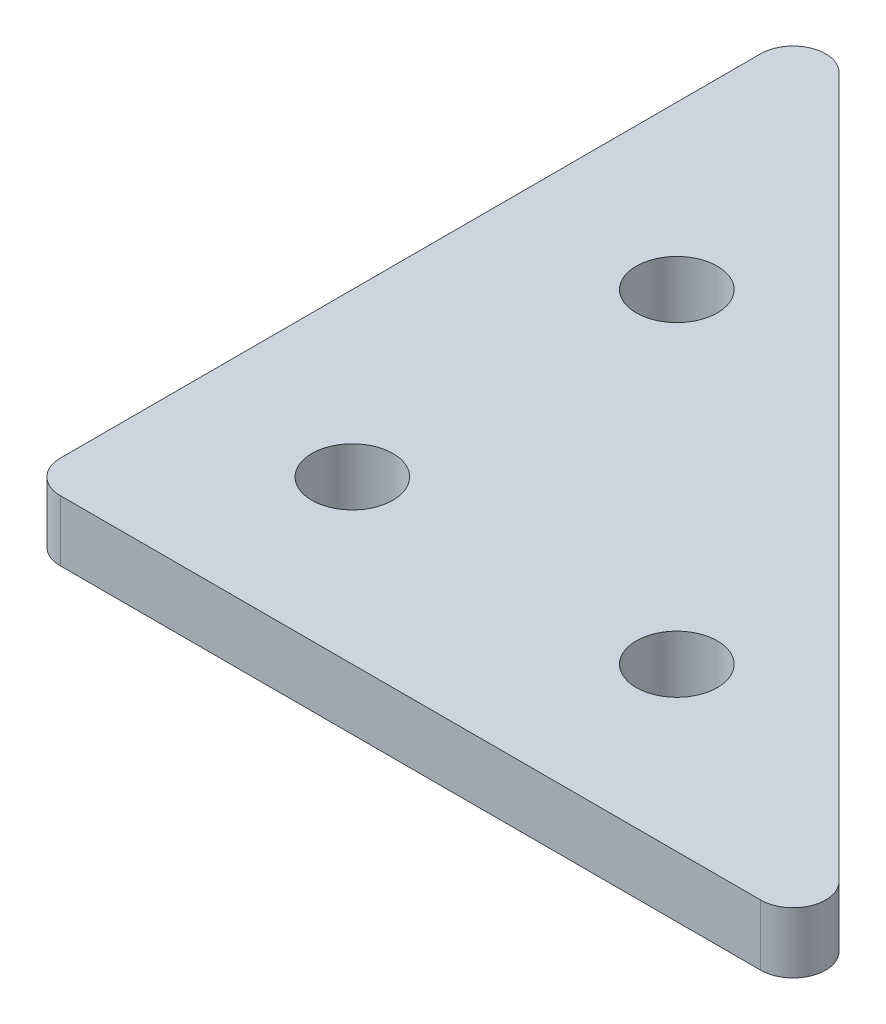
ISO-10303-21;
HEADER;
FILE_DESCRIPTION(('STEP AP214'),'2;1');
FILE_NAME('part.step','',(''),(''),'','','');
FILE_SCHEMA(('AUTOMOTIVE_DESIGN { 1 0 10303 214 1 1 1 1 }'));
ENDSEC;
DATA;
#1=APPLICATION_CONTEXT('core data for automotive mechanical design processes');
#2=APPLICATION_PROTOCOL_DEFINITION('international standard','automotive_design',2000,#1);
#3=PRODUCT_CONTEXT('',#1,'mechanical');
#4=PRODUCT('Part','Part','',(#3));
#5=PRODUCT_RELATED_PRODUCT_CATEGORY('part','',(#4));
#6=PRODUCT_DEFINITION_FORMATION('','',#4);
#7=PRODUCT_DEFINITION_CONTEXT('part definition',#1,'design');
#8=PRODUCT_DEFINITION('design','',#6,#7);
#9=PRODUCT_DEFINITION_SHAPE('','',#8);
#10=(LENGTH_UNIT() NAMED_UNIT(*) SI_UNIT(.MILLI.,.METRE.));
#11=(NAMED_UNIT(*) PLANE_ANGLE_UNIT() SI_UNIT($,.RADIAN.));
#12=(NAMED_UNIT(*) SI_UNIT($,.STERADIAN.) SOLID_ANGLE_UNIT());
#13=UNCERTAINTY_MEASURE_WITH_UNIT(LENGTH_MEASURE(1.E-05),#10,'distance_accuracy_value','');
#14=(GEOMETRIC_REPRESENTATION_CONTEXT(3) GLOBAL_UNCERTAINTY_ASSIGNED_CONTEXT((#13)) GLOBAL_UNIT_ASSIGNED_CONTEXT((#10,
#11,#12)) REPRESENTATION_CONTEXT('',''));
#15=CARTESIAN_POINT('',(0.,0.,0.));
#16=DIRECTION('',(0.,0.,1.));
#17=DIRECTION('',(1.,0.,0.));
#18=AXIS2_PLACEMENT_3D('',#15,#16,#17);
#19=CARTESIAN_POINT('',(-431.938028743079,4.7625,385.332748685498));
#20=DIRECTION('',(0.,-1.,0.));
#21=DIRECTION('',(0.,0.,-1.));
#22=AXIS2_PLACEMENT_3D('',#19,#20,#21);
#23=CYLINDRICAL_SURFACE('',#22,2.54000000000121);
#24=CARTESIAN_POINT('',(-431.938028743079,0.,385.332748685498));
#25=DIRECTION('',(0.,1.,0.));
#26=DIRECTION('',(0.,0.,-1.));
#27=AXIS2_PLACEMENT_3D('',#24,#25,#26);
#28=CIRCLE('',#27,2.54000000000121);
#29=CARTESIAN_POINT('',(-430.141977518862,0.,383.536697461284));
#30=VERTEX_POINT('',#29);
#31=CARTESIAN_POINT('',(-434.478028743079,0.,385.332748685498));
#32=VERTEX_POINT('',#31);
#33=EDGE_CURVE('E121',#30,#32,#28,.T.);
#34=ORIENTED_EDGE('',*,*,#33,.T.);
#35=DIRECTION('',(0.,-1.,0.));
#36=VECTOR('',#35,1.);
#37=CARTESIAN_POINT('',(-434.478028743079,4.7625,385.332748685498));
#38=LINE('',#37,#36);
#39=CARTESIAN_POINT('',(-434.478028743079,4.7625,385.332748685498));
#40=VERTEX_POINT('',#39);
#41=EDGE_CURVE('E11',#40,#32,#38,.T.);
#42=ORIENTED_EDGE('',*,*,#41,.F.);
#43=CARTESIAN_POINT('',(-431.938028743079,4.7625,385.332748685498));
#44=DIRECTION('',(0.,1.,0.));
#45=DIRECTION('',(0.,0.,-1.));
#46=AXIS2_PLACEMENT_3D('',#43,#44,#45);
#47=CIRCLE('',#46,2.54000000000121);
#48=CARTESIAN_POINT('',(-430.141977518862,4.7625,383.536697461284));
#49=VERTEX_POINT('',#48);
#50=EDGE_CURVE('E132',#49,#40,#47,.T.);
#51=ORIENTED_EDGE('',*,*,#50,.F.);
#52=DIRECTION('',(0.,-1.,0.));
#53=VECTOR('',#52,1.);
#54=CARTESIAN_POINT('',(-430.141977518862,4.7625,383.536697461284));
#55=LINE('',#54,#53);
#56=EDGE_CURVE('E117',#49,#30,#55,.T.);
#57=ORIENTED_EDGE('',*,*,#56,.T.);
#58=EDGE_LOOP('',(#34,#42,#51,#57));
#59=FACE_BOUND('',#58,.T.);
#60=ADVANCED_FACE('F37',(#59),#23,.T.);
#61=CARTESIAN_POINT('',(-434.478028743079,4.7625,440.160646237068));
#62=DIRECTION('',(1.,0.,0.));
#63=DIRECTION('',(0.,0.,-1.));
#64=AXIS2_PLACEMENT_3D('',#61,#62,#63);
#65=PLANE('',#64);
#66=DIRECTION('',(0.,0.,1.));
#67=VECTOR('',#66,1.);
#68=CARTESIAN_POINT('',(-434.478028743079,0.,440.160646237068));
#69=LINE('',#68,#67);
#70=CARTESIAN_POINT('',(-434.478028743079,0.,440.160646237068));
#71=VERTEX_POINT('',#70);
#72=EDGE_CURVE('E124',#32,#71,#69,.T.);
#73=ORIENTED_EDGE('',*,*,#72,.T.);
#74=DIRECTION('',(0.,-1.,0.));
#75=VECTOR('',#74,1.);
#76=CARTESIAN_POINT('',(-434.478028743079,4.7625,440.160646237068));
#77=LINE('',#76,#75);
#78=CARTESIAN_POINT('',(-434.478028743079,4.7625,440.160646237068));
#79=VERTEX_POINT('',#78);
#80=EDGE_CURVE('E45',#79,#71,#77,.T.);
#81=ORIENTED_EDGE('',*,*,#80,.F.);
#82=DIRECTION('',(0.,0.,1.));
#83=VECTOR('',#82,1.);
#84=CARTESIAN_POINT('',(-434.478028743079,4.7625,440.160646237068));
#85=LINE('',#84,#83);
#86=EDGE_CURVE('E90',#40,#79,#85,.T.);
#87=ORIENTED_EDGE('',*,*,#86,.F.);
#88=ORIENTED_EDGE('',*,*,#41,.T.);
#89=EDGE_LOOP('',(#73,#81,#87,#88));
#90=FACE_BOUND('',#89,.T.);
#91=ADVANCED_FACE('F157',(#90),#65,.F.);
#92=CARTESIAN_POINT('',(-431.938028743079,4.7625,440.160646237068));
#93=DIRECTION('',(0.,-1.,0.));
#94=DIRECTION('',(0.,0.,-1.));
#95=AXIS2_PLACEMENT_3D('',#92,#93,#94);
#96=CYLINDRICAL_SURFACE('',#95,2.53999999999999);
#97=CARTESIAN_POINT('',(-431.938028743079,0.,440.160646237068));
#98=DIRECTION('',(0.,1.,0.));
#99=DIRECTION('',(0.,0.,1.));
#100=AXIS2_PLACEMENT_3D('',#97,#98,#99);
#101=CIRCLE('',#100,2.53999999999999);
#102=CARTESIAN_POINT('',(-431.938028743079,0.,442.700646237068));
#103=VERTEX_POINT('',#102);
#104=EDGE_CURVE('E127',#71,#103,#101,.T.);
#105=ORIENTED_EDGE('',*,*,#104,.T.);
#106=DIRECTION('',(0.,-1.,0.));
#107=VECTOR('',#106,1.);
#108=CARTESIAN_POINT('',(-431.938028743079,4.7625,442.700646237068));
#109=LINE('',#108,#107);
#110=CARTESIAN_POINT('',(-431.938028743079,4.7625,442.700646237068));
#111=VERTEX_POINT('',#110);
#112=EDGE_CURVE('E112',#111,#103,#109,.T.);
#113=ORIENTED_EDGE('',*,*,#112,.F.);
#114=CARTESIAN_POINT('',(-431.938028743079,4.7625,440.160646237068));
#115=DIRECTION('',(0.,1.,0.));
#116=DIRECTION('',(0.,0.,1.));
#117=AXIS2_PLACEMENT_3D('',#114,#115,#116);
#118=CIRCLE('',#117,2.53999999999999);
#119=EDGE_CURVE('E103',#79,#111,#118,.T.);
#120=ORIENTED_EDGE('',*,*,#119,.F.);
#121=ORIENTED_EDGE('',*,*,#80,.T.);
#122=EDGE_LOOP('',(#105,#113,#120,#121));
#123=FACE_BOUND('',#122,.T.);
#124=ADVANCED_FACE('F138',(#123),#96,.T.);
#125=CARTESIAN_POINT('',(-431.938028743079,4.7625,442.700646237068));
#126=DIRECTION('',(0.,0.,-1.));
#127=DIRECTION('',(-1.,0.,0.));
#128=AXIS2_PLACEMENT_3D('',#125,#126,#127);
#129=PLANE('',#128);
#130=DIRECTION('',(1.,0.,0.));
#131=VECTOR('',#130,1.);
#132=CARTESIAN_POINT('',(-431.938028743079,0.,442.700646237068));
#133=LINE('',#132,#131);
#134=CARTESIAN_POINT('',(-377.110131191509,0.,442.700646237068));
#135=VERTEX_POINT('',#134);
#136=EDGE_CURVE('E111',#103,#135,#133,.T.);
#137=ORIENTED_EDGE('',*,*,#136,.T.);
#138=DIRECTION('',(0.,-1.,0.));
#139=VECTOR('',#138,1.);
#140=CARTESIAN_POINT('',(-377.110131191509,4.7625,442.700646237068));
#141=LINE('',#140,#139);
#142=CARTESIAN_POINT('',(-377.110131191509,4.7625,442.700646237068));
#143=VERTEX_POINT('',#142);
#144=EDGE_CURVE('E108',#143,#135,#141,.T.);
#145=ORIENTED_EDGE('',*,*,#144,.F.);
#146=DIRECTION('',(1.,0.,0.));
#147=VECTOR('',#146,1.);
#148=CARTESIAN_POINT('',(-431.938028743079,4.7625,442.700646237068));
#149=LINE('',#148,#147);
#150=EDGE_CURVE('E97',#111,#143,#149,.T.);
#151=ORIENTED_EDGE('',*,*,#150,.F.);
#152=ORIENTED_EDGE('',*,*,#112,.T.);
#153=EDGE_LOOP('',(#137,#145,#151,#152));
#154=FACE_BOUND('',#153,.T.);
#155=ADVANCED_FACE('F109',(#154),#129,.F.);
#156=CARTESIAN_POINT('',(-377.110131191509,4.7625,440.160646237068));
#157=DIRECTION('',(0.,-1.,0.));
#158=DIRECTION('',(0.,0.,-1.));
#159=AXIS2_PLACEMENT_3D('',#156,#157,#158);
#160=CYLINDRICAL_SURFACE('',#159,2.54000000000002);
#161=CARTESIAN_POINT('',(-377.110131191509,0.,440.160646237068));
#162=DIRECTION('',(0.,1.,0.));
#163=DIRECTION('',(0.,0.,-1.));
#164=AXIS2_PLACEMENT_3D('',#161,#162,#163);
#165=CIRCLE('',#164,2.54000000000002);
#166=CARTESIAN_POINT('',(-375.314079967296,0.,438.364595012854));
#167=VERTEX_POINT('',#166);
#168=EDGE_CURVE('E76',#135,#167,#165,.T.);
#169=ORIENTED_EDGE('',*,*,#168,.T.);
#170=DIRECTION('',(0.,-1.,0.));
#171=VECTOR('',#170,1.);
#172=CARTESIAN_POINT('',(-375.314079967296,4.7625,438.364595012854));
#173=LINE('',#172,#171);
#174=CARTESIAN_POINT('',(-375.314079967296,4.7625,438.364595012854));
#175=VERTEX_POINT('',#174);
#176=EDGE_CURVE('E113',#175,#167,#173,.T.);
#177=ORIENTED_EDGE('',*,*,#176,.F.);
#178=CARTESIAN_POINT('',(-377.110131191509,4.7625,440.160646237068));
#179=DIRECTION('',(0.,1.,0.));
#180=DIRECTION('',(0.,0.,-1.));
#181=AXIS2_PLACEMENT_3D('',#178,#179,#180);
#182=CIRCLE('',#181,2.54000000000002);
#183=EDGE_CURVE('E101',#143,#175,#182,.T.);
#184=ORIENTED_EDGE('',*,*,#183,.F.);
#185=ORIENTED_EDGE('',*,*,#144,.T.);
#186=EDGE_LOOP('',(#169,#177,#184,#185));
#187=FACE_BOUND('',#186,.T.);
#188=ADVANCED_FACE('F115',(#187),#160,.T.);
#189=CARTESIAN_POINT('',(-430.141977518862,4.7625,383.536697461284));
#190=DIRECTION('',(-0.70710678118657,0.,0.707106781186525));
#191=DIRECTION('',(0.707106781186525,0.,0.70710678118657));
#192=AXIS2_PLACEMENT_3D('',#189,#190,#191);
#193=PLANE('',#192);
#194=DIRECTION('',(-0.707106781186525,0.,-0.70710678118657));
#195=VECTOR('',#194,1.);
#196=CARTESIAN_POINT('',(-430.141977518862,0.,383.536697461284));
#197=LINE('',#196,#195);
#198=EDGE_CURVE('E82',#167,#30,#197,.T.);
#199=ORIENTED_EDGE('',*,*,#198,.T.);
#200=ORIENTED_EDGE('',*,*,#56,.F.);
#201=DIRECTION('',(-0.707106781186525,0.,-0.70710678118657));
#202=VECTOR('',#201,1.);
#203=CARTESIAN_POINT('',(-430.141977518862,4.7625,383.536697461284));
#204=LINE('',#203,#202);
#205=EDGE_CURVE('E53',#175,#49,#204,.T.);
#206=ORIENTED_EDGE('',*,*,#205,.F.);
#207=ORIENTED_EDGE('',*,*,#176,.T.);
#208=EDGE_LOOP('',(#199,#200,#206,#207));
#209=FACE_BOUND('',#208,.T.);
#210=ADVANCED_FACE('F145',(#209),#193,.F.);
#211=CARTESIAN_POINT('',(-431.938028743079,4.7625,385.332748685498));
#212=DIRECTION('',(0.,-1.,0.));
#213=DIRECTION('',(0.,0.,-1.));
#214=AXIS2_PLACEMENT_3D('',#211,#212,#213);
#215=PLANE('',#214);
#216=CARTESIAN_POINT('',(-421.77802874308,4.7625,404.600646237063));
#217=DIRECTION('',(0.,1.,0.));
#218=DIRECTION('',(0.,0.,1.));
#219=AXIS2_PLACEMENT_3D('',#216,#217,#218);
#220=CIRCLE('',#219,3.17499999999998);
#221=CARTESIAN_POINT('',(-421.77802874308,4.7625,407.775646237063));
#222=VERTEX_POINT('',#221);
#223=EDGE_CURVE('E269',#222,#222,#220,.T.);
#224=ORIENTED_EDGE('',*,*,#223,.F.);
#225=EDGE_LOOP('',(#224));
#226=FACE_BOUND('',#225,.T.);
#227=CARTESIAN_POINT('',(-421.77802874308,4.7625,430.000646237063));
#228=DIRECTION('',(0.,1.,0.));
#229=DIRECTION('',(0.,0.,1.));
#230=AXIS2_PLACEMENT_3D('',#227,#228,#229);
#231=CIRCLE('',#230,3.17499999999998);
#232=CARTESIAN_POINT('',(-421.77802874308,4.7625,433.175646237063));
#233=VERTEX_POINT('',#232);
#234=EDGE_CURVE('E271',#233,#233,#231,.T.);
#235=ORIENTED_EDGE('',*,*,#234,.F.);
#236=EDGE_LOOP('',(#235));
#237=FACE_BOUND('',#236,.T.);
#238=CARTESIAN_POINT('',(-396.378028755225,4.7625,430.000646237064));
#239=DIRECTION('',(0.,1.,0.));
#240=DIRECTION('',(0.,0.,1.));
#241=AXIS2_PLACEMENT_3D('',#238,#239,#240);
#242=CIRCLE('',#241,3.17499999999998);
#243=CARTESIAN_POINT('',(-396.378028755225,4.7625,433.175646237064));
#244=VERTEX_POINT('',#243);
#245=EDGE_CURVE('E279',#244,#244,#242,.T.);
#246=ORIENTED_EDGE('',*,*,#245,.F.);
#247=EDGE_LOOP('',(#246));
#248=FACE_BOUND('',#247,.T.);
#249=ORIENTED_EDGE('',*,*,#50,.T.);
#250=ORIENTED_EDGE('',*,*,#86,.T.);
#251=ORIENTED_EDGE('',*,*,#119,.T.);
#252=ORIENTED_EDGE('',*,*,#150,.T.);
#253=ORIENTED_EDGE('',*,*,#183,.T.);
#254=ORIENTED_EDGE('',*,*,#205,.T.);
#255=EDGE_LOOP('',(#249,#250,#251,#252,#253,#254));
#256=FACE_BOUND('',#255,.T.);
#257=ADVANCED_FACE('F99',(#226,#237,#248,#256),#215,.F.);
#258=CARTESIAN_POINT('',(-431.938028743079,0.,385.332748685498));
#259=DIRECTION('',(0.,-1.,0.));
#260=DIRECTION('',(0.,0.,-1.));
#261=AXIS2_PLACEMENT_3D('',#258,#259,#260);
#262=PLANE('',#261);
#263=CARTESIAN_POINT('',(-421.77802874308,0.,404.600646237063));
#264=DIRECTION('',(0.,1.,0.));
#265=DIRECTION('',(0.,0.,1.));
#266=AXIS2_PLACEMENT_3D('',#263,#264,#265);
#267=CIRCLE('',#266,3.17499999999998);
#268=CARTESIAN_POINT('',(-421.77802874308,0.,407.775646237063));
#269=VERTEX_POINT('',#268);
#270=EDGE_CURVE('E266',#269,#269,#267,.T.);
#271=ORIENTED_EDGE('',*,*,#270,.T.);
#272=EDGE_LOOP('',(#271));
#273=FACE_BOUND('',#272,.T.);
#274=CARTESIAN_POINT('',(-421.77802874308,0.,430.000646237063));
#275=DIRECTION('',(0.,1.,0.));
#276=DIRECTION('',(0.,0.,1.));
#277=AXIS2_PLACEMENT_3D('',#274,#275,#276);
#278=CIRCLE('',#277,3.17499999999998);
#279=CARTESIAN_POINT('',(-421.77802874308,0.,433.175646237063));
#280=VERTEX_POINT('',#279);
#281=EDGE_CURVE('E276',#280,#280,#278,.T.);
#282=ORIENTED_EDGE('',*,*,#281,.T.);
#283=EDGE_LOOP('',(#282));
#284=FACE_BOUND('',#283,.T.);
#285=CARTESIAN_POINT('',(-396.378028755225,0.,430.000646237064));
#286=DIRECTION('',(0.,1.,0.));
#287=DIRECTION('',(0.,0.,1.));
#288=AXIS2_PLACEMENT_3D('',#285,#286,#287);
#289=CIRCLE('',#288,3.17499999999998);
#290=CARTESIAN_POINT('',(-396.378028755225,0.,433.175646237064));
#291=VERTEX_POINT('',#290);
#292=EDGE_CURVE('E125',#291,#291,#289,.T.);
#293=ORIENTED_EDGE('',*,*,#292,.T.);
#294=EDGE_LOOP('',(#293));
#295=FACE_BOUND('',#294,.T.);
#296=ORIENTED_EDGE('',*,*,#33,.F.);
#297=ORIENTED_EDGE('',*,*,#198,.F.);
#298=ORIENTED_EDGE('',*,*,#168,.F.);
#299=ORIENTED_EDGE('',*,*,#136,.F.);
#300=ORIENTED_EDGE('',*,*,#104,.F.);
#301=ORIENTED_EDGE('',*,*,#72,.F.);
#302=EDGE_LOOP('',(#296,#297,#298,#299,#300,#301));
#303=FACE_BOUND('',#302,.T.);
#304=ADVANCED_FACE('F141',(#273,#284,#295,#303),#262,.T.);
#305=CARTESIAN_POINT('',(-396.378028755225,4.7625,430.000646237064));
#306=DIRECTION('',(0.,1.,0.));
#307=DIRECTION('',(0.,0.,1.));
#308=AXIS2_PLACEMENT_3D('',#305,#306,#307);
#309=CYLINDRICAL_SURFACE('',#308,3.17499999999998);
#310=ORIENTED_EDGE('',*,*,#292,.F.);
#311=EDGE_LOOP('',(#310));
#312=FACE_BOUND('',#311,.T.);
#313=ORIENTED_EDGE('',*,*,#245,.T.);
#314=EDGE_LOOP('',(#313));
#315=FACE_BOUND('',#314,.T.);
#316=ADVANCED_FACE('F197',(#312,#315),#309,.F.);
#317=CARTESIAN_POINT('',(-421.77802874308,4.7625,430.000646237063));
#318=DIRECTION('',(0.,1.,0.));
#319=DIRECTION('',(0.,0.,1.));
#320=AXIS2_PLACEMENT_3D('',#317,#318,#319);
#321=CYLINDRICAL_SURFACE('',#320,3.17499999999998);
#322=ORIENTED_EDGE('',*,*,#281,.F.);
#323=EDGE_LOOP('',(#322));
#324=FACE_BOUND('',#323,.T.);
#325=ORIENTED_EDGE('',*,*,#234,.T.);
#326=EDGE_LOOP('',(#325));
#327=FACE_BOUND('',#326,.T.);
#328=ADVANCED_FACE('F207',(#324,#327),#321,.F.);
#329=CARTESIAN_POINT('',(-421.77802874308,4.7625,404.600646237063));
#330=DIRECTION('',(0.,1.,0.));
#331=DIRECTION('',(0.,0.,1.));
#332=AXIS2_PLACEMENT_3D('',#329,#330,#331);
#333=CYLINDRICAL_SURFACE('',#332,3.17499999999998);
#334=ORIENTED_EDGE('',*,*,#270,.F.);
#335=EDGE_LOOP('',(#334));
#336=FACE_BOUND('',#335,.T.);
#337=ORIENTED_EDGE('',*,*,#223,.T.);
#338=EDGE_LOOP('',(#337));
#339=FACE_BOUND('',#338,.T.);
#340=ADVANCED_FACE('F218',(#336,#339),#333,.F.);
#341=CLOSED_SHELL('',(#60,#91,#124,#155,#188,#210,#257,#304,#316,#328,#340));
#342=MANIFOLD_SOLID_BREP('B2',#341);
#343=ADVANCED_BREP_SHAPE_REPRESENTATION('',(#18,#342),#14);
#344=SHAPE_DEFINITION_REPRESENTATION(#9,#343);
ENDSEC;
END-ISO-10303-21;
